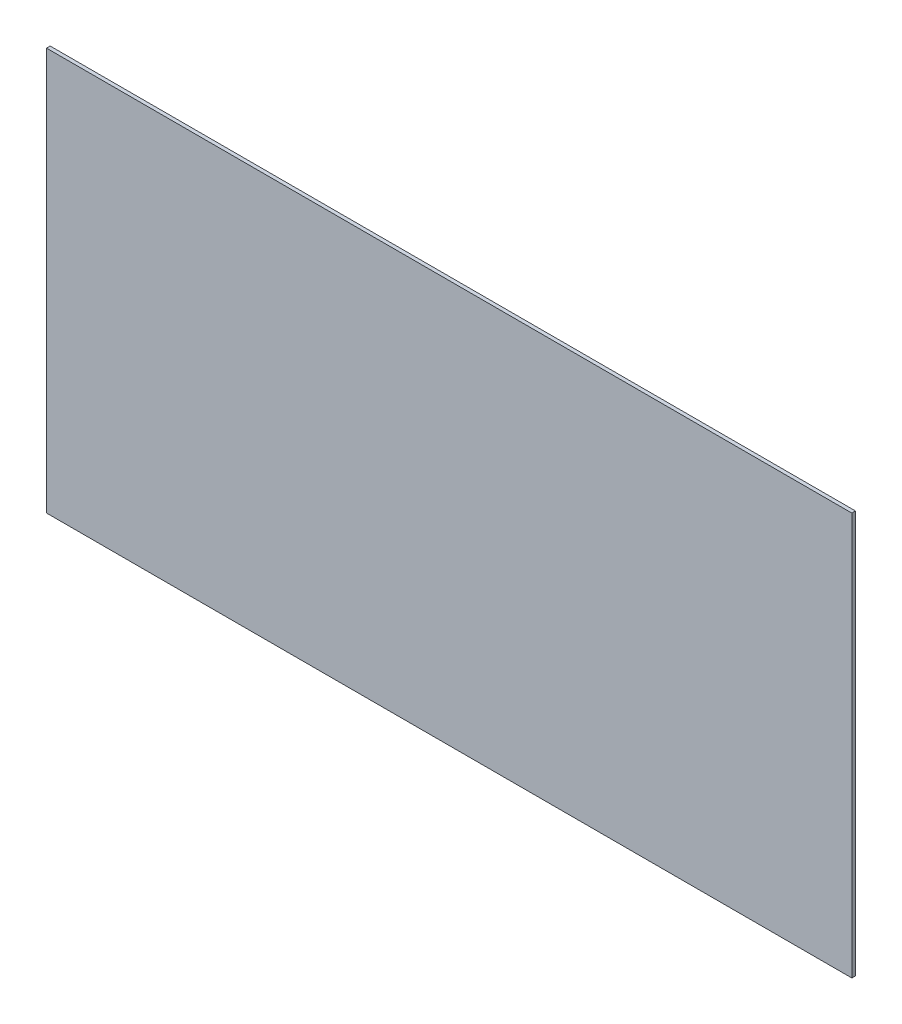
ISO-10303-21;
HEADER;
FILE_DESCRIPTION(('STEP AP214'),'2;1');
FILE_NAME('part.step','',(''),(''),'','','');
FILE_SCHEMA(('AUTOMOTIVE_DESIGN { 1 0 10303 214 1 1 1 1 }'));
ENDSEC;
DATA;
#1=APPLICATION_CONTEXT('core data for automotive mechanical design processes');
#2=APPLICATION_PROTOCOL_DEFINITION('international standard','automotive_design',2000,#1);
#3=PRODUCT_CONTEXT('',#1,'mechanical');
#4=PRODUCT('Part','Part','',(#3));
#5=PRODUCT_RELATED_PRODUCT_CATEGORY('part','',(#4));
#6=PRODUCT_DEFINITION_FORMATION('','',#4);
#7=PRODUCT_DEFINITION_CONTEXT('part definition',#1,'design');
#8=PRODUCT_DEFINITION('design','',#6,#7);
#9=PRODUCT_DEFINITION_SHAPE('','',#8);
#10=(LENGTH_UNIT() NAMED_UNIT(*) SI_UNIT(.MILLI.,.METRE.));
#11=(NAMED_UNIT(*) PLANE_ANGLE_UNIT() SI_UNIT($,.RADIAN.));
#12=(NAMED_UNIT(*) SI_UNIT($,.STERADIAN.) SOLID_ANGLE_UNIT());
#13=UNCERTAINTY_MEASURE_WITH_UNIT(LENGTH_MEASURE(1.E-05),#10,'distance_accuracy_value','');
#14=(GEOMETRIC_REPRESENTATION_CONTEXT(3) GLOBAL_UNCERTAINTY_ASSIGNED_CONTEXT((#13)) GLOBAL_UNIT_ASSIGNED_CONTEXT((#10,
#11,#12)) REPRESENTATION_CONTEXT('',''));
#15=CARTESIAN_POINT('',(0.,0.,0.));
#16=DIRECTION('',(0.,0.,1.));
#17=DIRECTION('',(1.,0.,0.));
#18=AXIS2_PLACEMENT_3D('',#15,#16,#17);
#19=CARTESIAN_POINT('',(-1100.,-550.,5.));
#20=DIRECTION('',(1.,0.,0.));
#21=DIRECTION('',(0.,0.,-1.));
#22=AXIS2_PLACEMENT_3D('',#19,#20,#21);
#23=PLANE('',#22);
#24=DIRECTION('',(0.,-1.,0.));
#25=VECTOR('',#24,1.);
#26=CARTESIAN_POINT('',(-1100.,-550.,-5.));
#27=LINE('',#26,#25);
#28=CARTESIAN_POINT('',(-1100.,550.,-5.));
#29=VERTEX_POINT('',#28);
#30=CARTESIAN_POINT('',(-1100.,-550.,-5.));
#31=VERTEX_POINT('',#30);
#32=EDGE_CURVE('E100',#29,#31,#27,.T.);
#33=ORIENTED_EDGE('',*,*,#32,.T.);
#34=DIRECTION('',(0.,0.,-1.));
#35=VECTOR('',#34,1.);
#36=CARTESIAN_POINT('',(-1100.,-550.,5.));
#37=LINE('',#36,#35);
#38=CARTESIAN_POINT('',(-1100.,-550.,5.));
#39=VERTEX_POINT('',#38);
#40=EDGE_CURVE('E11',#39,#31,#37,.T.);
#41=ORIENTED_EDGE('',*,*,#40,.F.);
#42=DIRECTION('',(0.,-1.,0.));
#43=VECTOR('',#42,1.);
#44=CARTESIAN_POINT('',(-1100.,-550.,5.));
#45=LINE('',#44,#43);
#46=CARTESIAN_POINT('',(-1100.,550.,5.));
#47=VERTEX_POINT('',#46);
#48=EDGE_CURVE('E88',#47,#39,#45,.T.);
#49=ORIENTED_EDGE('',*,*,#48,.F.);
#50=DIRECTION('',(0.,0.,-1.));
#51=VECTOR('',#50,1.);
#52=CARTESIAN_POINT('',(-1100.,550.,5.));
#53=LINE('',#52,#51);
#54=EDGE_CURVE('E96',#47,#29,#53,.T.);
#55=ORIENTED_EDGE('',*,*,#54,.T.);
#56=EDGE_LOOP('',(#33,#41,#49,#55));
#57=FACE_BOUND('',#56,.T.);
#58=ADVANCED_FACE('F37',(#57),#23,.F.);
#59=CARTESIAN_POINT('',(1100.,-550.,5.));
#60=DIRECTION('',(0.,1.,0.));
#61=DIRECTION('',(-1.,0.,0.));
#62=AXIS2_PLACEMENT_3D('',#59,#60,#61);
#63=PLANE('',#62);
#64=DIRECTION('',(1.,0.,0.));
#65=VECTOR('',#64,1.);
#66=CARTESIAN_POINT('',(1100.,-550.,-5.));
#67=LINE('',#66,#65);
#68=CARTESIAN_POINT('',(1100.,-550.,-5.));
#69=VERTEX_POINT('',#68);
#70=EDGE_CURVE('E92',#31,#69,#67,.T.);
#71=ORIENTED_EDGE('',*,*,#70,.T.);
#72=DIRECTION('',(0.,0.,-1.));
#73=VECTOR('',#72,1.);
#74=CARTESIAN_POINT('',(1100.,-550.,5.));
#75=LINE('',#74,#73);
#76=CARTESIAN_POINT('',(1100.,-550.,5.));
#77=VERTEX_POINT('',#76);
#78=EDGE_CURVE('E45',#77,#69,#75,.T.);
#79=ORIENTED_EDGE('',*,*,#78,.F.);
#80=DIRECTION('',(1.,0.,0.));
#81=VECTOR('',#80,1.);
#82=CARTESIAN_POINT('',(1100.,-550.,5.));
#83=LINE('',#82,#81);
#84=EDGE_CURVE('E83',#39,#77,#83,.T.);
#85=ORIENTED_EDGE('',*,*,#84,.F.);
#86=ORIENTED_EDGE('',*,*,#40,.T.);
#87=EDGE_LOOP('',(#71,#79,#85,#86));
#88=FACE_BOUND('',#87,.T.);
#89=ADVANCED_FACE('F91',(#88),#63,.F.);
#90=CARTESIAN_POINT('',(1100.,-550.,5.));
#91=DIRECTION('',(-1.,0.,0.));
#92=DIRECTION('',(0.,0.,1.));
#93=AXIS2_PLACEMENT_3D('',#90,#91,#92);
#94=PLANE('',#93);
#95=DIRECTION('',(0.,1.,0.));
#96=VECTOR('',#95,1.);
#97=CARTESIAN_POINT('',(1100.,-550.,-5.));
#98=LINE('',#97,#96);
#99=CARTESIAN_POINT('',(1100.,550.,-5.));
#100=VERTEX_POINT('',#99);
#101=EDGE_CURVE('E70',#69,#100,#98,.T.);
#102=ORIENTED_EDGE('',*,*,#101,.T.);
#103=DIRECTION('',(0.,0.,-1.));
#104=VECTOR('',#103,1.);
#105=CARTESIAN_POINT('',(1100.,550.,5.));
#106=LINE('',#105,#104);
#107=CARTESIAN_POINT('',(1100.,550.,5.));
#108=VERTEX_POINT('',#107);
#109=EDGE_CURVE('E93',#108,#100,#106,.T.);
#110=ORIENTED_EDGE('',*,*,#109,.F.);
#111=DIRECTION('',(0.,1.,0.));
#112=VECTOR('',#111,1.);
#113=CARTESIAN_POINT('',(1100.,-550.,5.));
#114=LINE('',#113,#112);
#115=EDGE_CURVE('E86',#77,#108,#114,.T.);
#116=ORIENTED_EDGE('',*,*,#115,.F.);
#117=ORIENTED_EDGE('',*,*,#78,.T.);
#118=EDGE_LOOP('',(#102,#110,#116,#117));
#119=FACE_BOUND('',#118,.T.);
#120=ADVANCED_FACE('F94',(#119),#94,.F.);
#121=CARTESIAN_POINT('',(1100.,550.,5.));
#122=DIRECTION('',(0.,-1.,0.));
#123=DIRECTION('',(1.,0.,0.));
#124=AXIS2_PLACEMENT_3D('',#121,#122,#123);
#125=PLANE('',#124);
#126=DIRECTION('',(-1.,0.,0.));
#127=VECTOR('',#126,1.);
#128=CARTESIAN_POINT('',(1100.,550.,-5.));
#129=LINE('',#128,#127);
#130=EDGE_CURVE('E76',#100,#29,#129,.T.);
#131=ORIENTED_EDGE('',*,*,#130,.T.);
#132=ORIENTED_EDGE('',*,*,#54,.F.);
#133=DIRECTION('',(-1.,0.,0.));
#134=VECTOR('',#133,1.);
#135=CARTESIAN_POINT('',(1100.,550.,5.));
#136=LINE('',#135,#134);
#137=EDGE_CURVE('E53',#108,#47,#136,.T.);
#138=ORIENTED_EDGE('',*,*,#137,.F.);
#139=ORIENTED_EDGE('',*,*,#109,.T.);
#140=EDGE_LOOP('',(#131,#132,#138,#139));
#141=FACE_BOUND('',#140,.T.);
#142=ADVANCED_FACE('F107',(#141),#125,.F.);
#143=CARTESIAN_POINT('',(0.,0.,5.));
#144=DIRECTION('',(0.,0.,1.));
#145=DIRECTION('',(1.,0.,0.));
#146=AXIS2_PLACEMENT_3D('',#143,#144,#145);
#147=PLANE('',#146);
#148=ORIENTED_EDGE('',*,*,#48,.T.);
#149=ORIENTED_EDGE('',*,*,#84,.T.);
#150=ORIENTED_EDGE('',*,*,#115,.T.);
#151=ORIENTED_EDGE('',*,*,#137,.T.);
#152=EDGE_LOOP('',(#148,#149,#150,#151));
#153=FACE_BOUND('',#152,.T.);
#154=ADVANCED_FACE('F84',(#153),#147,.T.);
#155=CARTESIAN_POINT('',(0.,0.,-5.));
#156=DIRECTION('',(0.,0.,1.));
#157=DIRECTION('',(1.,0.,0.));
#158=AXIS2_PLACEMENT_3D('',#155,#156,#157);
#159=PLANE('',#158);
#160=ORIENTED_EDGE('',*,*,#32,.F.);
#161=ORIENTED_EDGE('',*,*,#130,.F.);
#162=ORIENTED_EDGE('',*,*,#101,.F.);
#163=ORIENTED_EDGE('',*,*,#70,.F.);
#164=EDGE_LOOP('',(#160,#161,#162,#163));
#165=FACE_BOUND('',#164,.T.);
#166=ADVANCED_FACE('F110',(#165),#159,.F.);
#167=CLOSED_SHELL('',(#58,#89,#120,#142,#154,#166));
#168=MANIFOLD_SOLID_BREP('B2',#167);
#169=ADVANCED_BREP_SHAPE_REPRESENTATION('',(#18,#168),#14);
#170=SHAPE_DEFINITION_REPRESENTATION(#9,#169);
ENDSEC;
END-ISO-10303-21;
